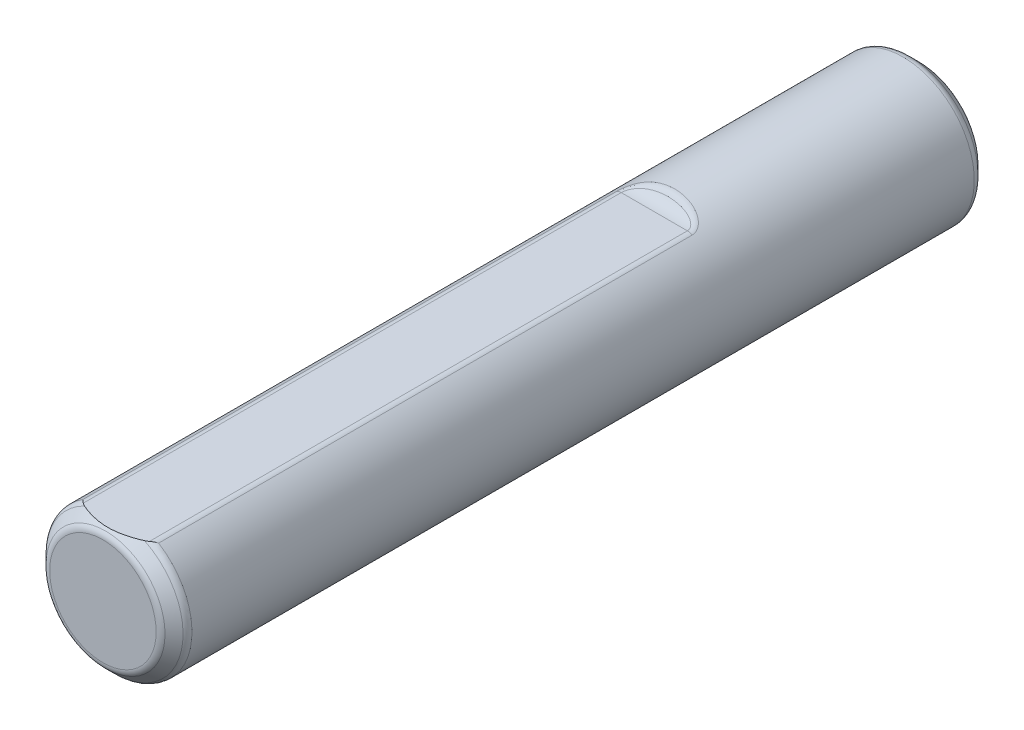
ISO-10303-21;
HEADER;
FILE_DESCRIPTION(('STEP AP214'),'2;1');
FILE_NAME('part.step','',(''),(''),'','','');
FILE_SCHEMA(('AUTOMOTIVE_DESIGN { 1 0 10303 214 1 1 1 1 }'));
ENDSEC;
DATA;
#1=APPLICATION_CONTEXT('core data for automotive mechanical design processes');
#2=APPLICATION_PROTOCOL_DEFINITION('international standard','automotive_design',2000,#1);
#3=PRODUCT_CONTEXT('',#1,'mechanical');
#4=PRODUCT('Part','Part','',(#3));
#5=PRODUCT_RELATED_PRODUCT_CATEGORY('part','',(#4));
#6=PRODUCT_DEFINITION_FORMATION('','',#4);
#7=PRODUCT_DEFINITION_CONTEXT('part definition',#1,'design');
#8=PRODUCT_DEFINITION('design','',#6,#7);
#9=PRODUCT_DEFINITION_SHAPE('','',#8);
#10=(LENGTH_UNIT() NAMED_UNIT(*) SI_UNIT(.MILLI.,.METRE.));
#11=(NAMED_UNIT(*) PLANE_ANGLE_UNIT() SI_UNIT($,.RADIAN.));
#12=(NAMED_UNIT(*) SI_UNIT($,.STERADIAN.) SOLID_ANGLE_UNIT());
#13=UNCERTAINTY_MEASURE_WITH_UNIT(LENGTH_MEASURE(1.E-05),#10,'distance_accuracy_value','');
#14=(GEOMETRIC_REPRESENTATION_CONTEXT(3) GLOBAL_UNCERTAINTY_ASSIGNED_CONTEXT((#13)) GLOBAL_UNIT_ASSIGNED_CONTEXT((#10,
#11,#12)) REPRESENTATION_CONTEXT('',''));
#15=CARTESIAN_POINT('',(0.,0.,0.));
#16=DIRECTION('',(0.,0.,1.));
#17=DIRECTION('',(1.,0.,0.));
#18=AXIS2_PLACEMENT_3D('',#15,#16,#17);
#19=CARTESIAN_POINT('',(0.,0.,18.25625));
#20=DIRECTION('',(0.,0.,-1.));
#21=DIRECTION('',(-1.,0.,0.));
#22=AXIS2_PLACEMENT_3D('',#19,#20,#21);
#23=CYLINDRICAL_SURFACE('',#22,3.175);
#24=CARTESIAN_POINT('',(0.,0.,-17.4568589924332));
#25=DIRECTION('',(0.,0.,-1.));
#26=DIRECTION('',(-1.,0.,0.));
#27=AXIS2_PLACEMENT_3D('',#24,#25,#26);
#28=CIRCLE('',#27,3.175);
#29=CARTESIAN_POINT('',(-3.175,0.,-17.4568589924332));
#30=VERTEX_POINT('',#29);
#31=EDGE_CURVE('E104',#30,#30,#28,.F.);
#32=ORIENTED_EDGE('',*,*,#31,.T.);
#33=EDGE_LOOP('',(#32));
#34=FACE_BOUND('',#33,.T.);
#35=CARTESIAN_POINT('',(-1.32207165040263,2.8100467823214,-6.04625587952027));
#36=CARTESIAN_POINT('',(-1.42627070195704,2.83824671321854,-5.97817237371202));
#37=CARTESIAN_POINT('',(-1.51093902903158,2.79243410854207,-5.8943838192804));
#38=CARTESIAN_POINT('',(-1.34474557274361,2.80186898455058,-6.06594801067835));
#39=CARTESIAN_POINT('',(-1.45041225417174,2.82620009536666,-6.00200570649206));
#40=CARTESIAN_POINT('',(-1.53685208313555,2.77841502664925,-5.92392201601751));
#41=CARTESIAN_POINT('',(-1.36543574553839,2.7941311889469,-6.08692422193137));
#42=CARTESIAN_POINT('',(-1.47246915464072,2.81480971971252,-6.02752947407041));
#43=CARTESIAN_POINT('',(-1.56049799490102,2.76515023418578,-5.95538633289705));
#44=CARTESIAN_POINT('',(-1.40223657039543,2.78003817756422,-6.13118183727184));
#45=CARTESIAN_POINT('',(-1.5116654460137,2.79411123493885,-6.08150892814963));
#46=CARTESIAN_POINT('',(-1.60255608045192,2.74099078610117,-6.02177275590777));
#47=CARTESIAN_POINT('',(-1.41831957461626,2.77369136038421,-6.15447607274859));
#48=CARTESIAN_POINT('',(-1.52879794908003,2.78480488596988,-6.10999053152303));
#49=CARTESIAN_POINT('',(-1.62093665670429,2.73011052807828,-6.05671410912289));
#50=CARTESIAN_POINT('',(-1.44408388792938,2.76336328828293,-6.20118659029518));
#51=CARTESIAN_POINT('',(-1.55622164743804,2.76968784536467,-6.16719782952973));
#52=CARTESIAN_POINT('',(-1.65038158620501,2.71240526161898,-6.12677988544277));
#53=CARTESIAN_POINT('',(-1.45413205218166,2.75924841799026,-6.22448217747395));
#54=CARTESIAN_POINT('',(-1.56691957925823,2.76367177885102,-6.19577981359027));
#55=CARTESIAN_POINT('',(-1.66186520249333,2.70535119826017,-6.1617232662109));
#56=CARTESIAN_POINT('',(-1.46900725276046,2.75311439120509,-6.27198493605406));
#57=CARTESIAN_POINT('',(-1.58274531113447,2.75471423353387,-6.25410055052108));
#58=CARTESIAN_POINT('',(-1.67886543172624,2.69483572377119,-6.23297740408111));
#59=CARTESIAN_POINT('',(-1.47385766076059,2.75108585519742,-6.29618751608562));
#60=CARTESIAN_POINT('',(-1.58790780156396,2.75175354085903,-6.28385028585637));
#61=CARTESIAN_POINT('',(-1.68440875515493,2.69135823347215,-6.2692812741285));
#62=CARTESIAN_POINT('',(-1.47689967821775,2.74981272109505,-6.33032116283234));
#63=CARTESIAN_POINT('',(-1.59114427374145,2.74989619556427,-6.32580864544486));
#64=CARTESIAN_POINT('',(-1.68788534653458,2.6891757178684,-6.32048174424848));
#65=CARTESIAN_POINT('',(-1.47733721054668,2.7496293720565,-6.34015722021935));
#66=CARTESIAN_POINT('',(-1.59160974358518,2.74962875336928,-6.33790053133293));
#67=CARTESIAN_POINT('',(-1.68838538348195,2.68886140523105,-6.33523583032894));
#68=CARTESIAN_POINT('',(-1.47732956919922,2.74963428952543,-6.37782500598482));
#69=CARTESIAN_POINT('',(-1.59160112037149,2.74963603852293,-6.38420455736032));
#70=CARTESIAN_POINT('',(-1.68837665051333,2.68886983517685,-6.39173750897748));
#71=CARTESIAN_POINT('',(-1.47381137403713,2.75111344736394,-6.40570373480625));
#72=CARTESIAN_POINT('',(-1.58785619112029,2.75179433014627,-6.41848914172735));
#73=CARTESIAN_POINT('',(-1.68435585604196,2.69140553432475,-6.43355560221106));
#74=CARTESIAN_POINT('',(-1.45992987632037,2.75686591127611,-6.46044023231048));
#75=CARTESIAN_POINT('',(-1.57308880254845,2.76019127081532,-6.4857189373531));
#76=CARTESIAN_POINT('',(-1.66849128722376,2.70126690104039,-6.51566034846404));
#77=CARTESIAN_POINT('',(-1.44954556040068,2.76114779452294,-6.48729459829238));
#78=CARTESIAN_POINT('',(-1.56203184542318,2.76644930957503,-6.51868616802151));
#79=CARTESIAN_POINT('',(-1.65662349760259,2.70860727233362,-6.55594189743208));
#80=CARTESIAN_POINT('',(-1.42264538468785,2.77197570062903,-6.53884313195875));
#81=CARTESIAN_POINT('',(-1.53340288379502,2.7822917200939,-6.58183960338655));
#82=CARTESIAN_POINT('',(-1.62588043964145,2.72716939705208,-6.63326469794456));
#83=CARTESIAN_POINT('',(-1.40617966295608,2.77850318034929,-6.56355297813435));
#84=CARTESIAN_POINT('',(-1.51586266131256,2.79186030025682,-6.61206613291999));
#85=CARTESIAN_POINT('',(-1.60706247194307,2.73835936223949,-6.67032946722552));
#86=CARTESIAN_POINT('',(-1.36791385886504,2.79320324032788,-6.6105408173833));
#87=CARTESIAN_POINT('',(-1.47510747952988,2.81344564160556,-6.66938766966213));
#88=CARTESIAN_POINT('',(-1.56333012442394,2.76355946518937,-6.7408112260509));
#89=CARTESIAN_POINT('',(-1.34610530378368,2.80137842985475,-6.63281486579089));
#90=CARTESIAN_POINT('',(-1.45185719793936,2.82547892059554,-6.69648868940852));
#91=CARTESIAN_POINT('',(-1.53840606149228,2.77757407598398,-6.77422229859656));
#92=CARTESIAN_POINT('',(-1.29104891474577,2.82123592626427,-6.68075968592093));
#93=CARTESIAN_POINT('',(-1.39313310848543,2.85478254218719,-6.75464460090985));
#94=CARTESIAN_POINT('',(-1.47548447396263,2.81161549784616,-6.84613952899727));
#95=CARTESIAN_POINT('',(-1.25631877606677,2.83324676593788,-6.70553458977082));
#96=CARTESIAN_POINT('',(-1.35605064401268,2.87256343362649,-6.78453135842377));
#97=CARTESIAN_POINT('',(-1.43579288679562,2.83220550770484,-6.88330188514706));
#98=CARTESIAN_POINT('',(-1.18121513756945,2.8576932692922,-6.75066592284944));
#99=CARTESIAN_POINT('',(-1.27582496624973,2.90887047977529,-6.8386770355743));
#100=CARTESIAN_POINT('',(-1.34996015708952,2.87411379914154,-6.95099888478773));
#101=CARTESIAN_POINT('',(-1.14083144085465,2.87012966920092,-6.77101419486451));
#102=CARTESIAN_POINT('',(-1.23262267505968,2.92741067672239,-6.86291407072626));
#103=CARTESIAN_POINT('',(-1.30380736095487,2.89543334282839,-6.98152129245677));
#104=CARTESIAN_POINT('',(-1.03746299405192,2.8997840680519,-6.81564433321683));
#105=CARTESIAN_POINT('',(-1.12183132213562,2.97181924282382,-6.91579190109043));
#106=CARTESIAN_POINT('',(-1.18567199323355,2.94626945603067,-7.04846649959593));
#107=CARTESIAN_POINT('',(-0.972265448665181,2.91673986171008,-6.83781219861418));
#108=CARTESIAN_POINT('',(-1.05187455808933,2.99731705254845,-6.94166052786583));
#109=CARTESIAN_POINT('',(-1.11116051264025,2.97533653011796,-7.08171829786016));
#110=CARTESIAN_POINT('',(-0.836336280405914,2.9479495099681,-6.87544808570067));
#111=CARTESIAN_POINT('',(-0.905746169692841,3.044492616748,-6.98517396658918));
#112=CARTESIAN_POINT('',(-0.955812891731555,3.02883878392182,-7.13817212861459));
#113=CARTESIAN_POINT('',(-0.765593451959779,2.96219768341735,-6.89090210579454));
#114=CARTESIAN_POINT('',(-0.829561662036831,3.06612117613531,-7.00273036040346));
#115=CARTESIAN_POINT('',(-0.874963945046859,3.05326422452552,-7.16135315871143));
#116=CARTESIAN_POINT('',(-0.590781972742733,2.99221316915946,-6.92175235918077));
#117=CARTESIAN_POINT('',(-0.640639053889406,3.11196873120621,-7.03753518672004));
#118=CARTESIAN_POINT('',(-0.675179397490837,3.10471934337655,-7.20762853874378));
#119=CARTESIAN_POINT('',(-0.484975349899006,3.00619434187599,-6.93450971425422));
#120=CARTESIAN_POINT('',(-0.526287088079069,3.13337354142008,-7.05148623665805));
#121=CARTESIAN_POINT('',(-0.554257542761624,3.12868706784207,-7.22676457137517));
#122=CARTESIAN_POINT('',(-0.270195437416657,3.02585393143428,-6.95197106065672));
#123=CARTESIAN_POINT('',(-0.293328433212091,3.16365728802855,-7.07052799525626));
#124=CARTESIAN_POINT('',(-0.308794785599109,3.16238922124335,-7.25295659099124));
#125=CARTESIAN_POINT('',(-0.161218330389011,3.03152187792551,-6.95666489740898));
#126=CARTESIAN_POINT('',(-0.175190363195909,3.17238946115066,-7.07551996156965));
#127=CARTESIAN_POINT('',(-0.184249520435573,3.17210570100708,-7.25999734611069));
#128=CARTESIAN_POINT('',(0.0593470236745363,3.03427620677836,-6.95897911169985));
#129=CARTESIAN_POINT('',(0.0645532373385034,3.17664967684363,-7.07800470574967));
#130=CARTESIAN_POINT('',(0.0678251699045632,3.17682740761028,-7.26346866755261));
#131=CARTESIAN_POINT('',(0.170943597179816,3.03118716750508,-6.95645488687237));
#132=CARTESIAN_POINT('',(0.185577019583757,3.17188686623728,-7.07533211758867));
#133=CARTESIAN_POINT('',(0.195364111046246,3.17153191164441,-7.25968233032642));
#134=CARTESIAN_POINT('',(0.391729869823104,3.01619061796338,-6.94347765803756));
#135=CARTESIAN_POINT('',(0.42528301594677,3.1487432457971,-7.06127979195355));
#136=CARTESIAN_POINT('',(0.447691279814216,3.14582354114076,-7.24021648703849));
#137=CARTESIAN_POINT('',(0.500922245066709,3.0042934823108,-6.93303398160536));
#138=CARTESIAN_POINT('',(0.543417519178574,3.13048768342262,-7.04997839470276));
#139=CARTESIAN_POINT('',(0.572482565846844,3.12542845165838,-7.22455097233951));
#140=CARTESIAN_POINT('',(0.682237603185872,2.97723196879833,-6.90655345477374));
#141=CARTESIAN_POINT('',(0.739647868769432,3.08902543385197,-7.02039941706576));
#142=CARTESIAN_POINT('',(0.779700117886866,3.07903728516344,-7.1848301822091));
#143=CARTESIAN_POINT('',(0.755860698789501,2.96404136033422,-6.89304638900379));
#144=CARTESIAN_POINT('',(0.819044639050527,3.0689374320709,-7.00521818908055));
#145=CARTESIAN_POINT('',(0.863840798488703,3.05642481307164,-7.16456958366231));
#146=CARTESIAN_POINT('',(0.898242766086338,2.9344285906304,-6.85962633819342));
#147=CARTESIAN_POINT('',(0.972347791597128,3.024013321321,-6.96694793183845));
#148=CARTESIAN_POINT('',(1.0265631611478,3.00566006532257,-7.11443950732362));
#149=CARTESIAN_POINT('',(0.967009999384453,2.91801210711701,-6.83972456966013));
#150=CARTESIAN_POINT('',(1.04623005434996,2.99923872305304,-6.94394438578667));
#151=CARTESIAN_POINT('',(1.10515428503887,2.97751752290831,-7.084586854293));
#152=CARTESIAN_POINT('',(1.07805979947977,2.88839923415911,-6.79885779551555));
#153=CARTESIAN_POINT('',(1.16541514966823,2.95472701221919,-6.89590460927435));
#154=CARTESIAN_POINT('',(1.23206834224264,2.92675259709854,-7.02328669341468));
#155=CARTESIAN_POINT('',(1.12224146156758,2.8756487657545,-6.779873110788));
#156=CARTESIAN_POINT('',(1.21273347542142,2.93565158288577,-6.87345703474821));
#157=CARTESIAN_POINT('',(1.28256167024745,2.90489465035819,-6.9948096666801));
#158=CARTESIAN_POINT('',(1.20530353514589,2.85009845492655,-6.73731529569357));
#159=CARTESIAN_POINT('',(1.30155502395066,2.89757560489682,-6.82270655339062));
#160=CARTESIAN_POINT('',(1.37748975446713,2.8610941179738,-6.9309729439574));
#161=CARTESIAN_POINT('',(1.24419263988976,2.8372987298649,-6.71374984792886));
#162=CARTESIAN_POINT('',(1.34311268282516,2.87856746998419,-6.79443232423601));
#163=CARTESIAN_POINT('',(1.42193444582813,2.83915173351746,-6.89562477187382));
#164=CARTESIAN_POINT('',(1.30703929081154,2.81556136343849,-6.66751710251426));
#165=CARTESIAN_POINT('',(1.41019932124402,2.84639621439673,-6.73858771799417));
#166=CARTESIAN_POINT('',(1.49375918931218,2.80188767569228,-6.82627565378662));
#167=CARTESIAN_POINT('',(1.33239620097094,2.80639624538967,-6.64580699388204));
#168=CARTESIAN_POINT('',(1.43724871339305,2.83287096100675,-6.71227039532437));
#169=CARTESIAN_POINT('',(1.52273851474008,2.78617604307316,-6.79371049112986));
#170=CARTESIAN_POINT('',(1.37779645716675,2.78948430735387,-6.59956518448832));
#171=CARTESIAN_POINT('',(1.48562712863314,2.8079813358103,-6.65602454607927));
#172=CARTESIAN_POINT('',(1.57462452182811,2.75718414924267,-6.72434777707755));
#173=CARTESIAN_POINT('',(1.39784881505763,2.78173508892843,-6.57503837202437));
#174=CARTESIAN_POINT('',(1.50699649473098,2.79659968600321,-6.62609474347805));
#175=CARTESIAN_POINT('',(1.59754150274885,2.74389977641685,-6.68755755812927));
#176=CARTESIAN_POINT('',(1.43187537936603,2.76831312545711,-6.52329461979339));
#177=CARTESIAN_POINT('',(1.54322072761075,2.77693105116248,-6.56281762999934));
#178=CARTESIAN_POINT('',(1.63642900516577,2.72089069737546,-6.60994192959637));
#179=CARTESIAN_POINT('',(1.44578208156869,2.76266354522238,-6.49605164646248));
#180=CARTESIAN_POINT('',(1.55803183525649,2.76866398090797,-6.52941818132377));
#181=CARTESIAN_POINT('',(1.65232237898135,2.71120570224261,-6.56907746966937));
#182=CARTESIAN_POINT('',(1.46630713805946,2.75424466328262,-6.43999394607865));
#183=CARTESIAN_POINT('',(1.57986987226772,2.75636470545645,-6.46062577791935));
#184=CARTESIAN_POINT('',(1.67577958630812,2.69677333289153,-6.48499091914222));
#185=CARTESIAN_POINT('',(1.47295033101748,2.75146554740608,-6.41118493144586));
#186=CARTESIAN_POINT('',(1.58694225565364,2.75230759388412,-6.42521287044414));
#187=CARTESIAN_POINT('',(1.68337180687005,2.69200913437728,-6.44177739717258));
#188=CARTESIAN_POINT('',(1.47681649013855,2.74984738855746,-6.37148756340825));
#189=CARTESIAN_POINT('',(1.59105582706194,2.74994675179592,-6.37641498313703));
#190=CARTESIAN_POINT('',(1.68779027444665,2.6892351478128,-6.38223134511098));
#191=CARTESIAN_POINT('',(1.47733775333248,2.74962903159685,-6.36074765550897));
#192=CARTESIAN_POINT('',(1.59161035429519,2.74962824886559,-6.36321180089439));
#193=CARTESIAN_POINT('',(1.68838600380945,2.68886082158892,-6.36612148326292));
#194=CARTESIAN_POINT('',(1.47732864767858,2.74963485969545,-6.32221088068855));
#195=CARTESIAN_POINT('',(1.59160008514671,2.7496368835271,-6.3158395738147));
#196=CARTESIAN_POINT('',(1.68837559734424,2.68887081260291,-6.30831632103418));
#197=CARTESIAN_POINT('',(1.47382029373183,2.75110971460775,-6.29436996614019));
#198=CARTESIAN_POINT('',(1.58786567169511,2.75178888992976,-6.28160171118982));
#199=CARTESIAN_POINT('',(1.6843660499785,2.69139913531625,-6.26655494921065));
#200=CARTESIAN_POINT('',(1.45995720759185,2.75685461616372,-6.23962880482375));
#201=CARTESIAN_POINT('',(1.57311790467366,2.76017476490073,-6.21436556413282));
#202=CARTESIAN_POINT('',(1.66852252296285,2.70124753798847,-6.18444320723526));
#203=CARTESIAN_POINT('',(1.44956368193998,2.76114049975895,-6.21273480281257));
#204=CARTESIAN_POINT('',(1.56205114733024,2.7664386265274,-6.18134896712554));
#205=CARTESIAN_POINT('',(1.65664420793162,2.70859476700712,-6.14410220421875));
#206=CARTESIAN_POINT('',(1.42258520702225,2.77199992389683,-6.16104684887082));
#207=CARTESIAN_POINT('',(1.53333868364277,2.78232724848016,-6.11802619439438));
#208=CARTESIAN_POINT('',(1.62581166516808,2.72721092267067,-6.06657027330633));
#209=CARTESIAN_POINT('',(1.40603113483383,2.77856204482809,-6.13624316798653));
#210=CARTESIAN_POINT('',(1.51570408669181,2.79194679037121,-6.08768731416044));
#211=CARTESIAN_POINT('',(1.60689272552427,2.73846027283889,-6.02936475197984));
#212=CARTESIAN_POINT('',(1.36772085352907,2.79327556980631,-6.0892441168747));
#213=CARTESIAN_POINT('',(1.47490221215476,2.81355183748334,-6.03034779774084));
#214=CARTESIAN_POINT('',(1.56310954689047,2.76368345851653,-5.958866175312));
#215=CARTESIAN_POINT('',(1.34600332458098,2.80141507736347,-6.06703110107984));
#216=CARTESIAN_POINT('',(1.4517496862216,2.82553232154174,-6.00331288247671));
#217=CARTESIAN_POINT('',(1.53828951380704,2.77763690004342,-5.92554665161965));
#218=CARTESIAN_POINT('',(1.32207165040264,2.8100467823214,-6.04625587952028));
#219=CARTESIAN_POINT('',(1.42627070195705,2.83824671321853,-5.97817237371203));
#220=CARTESIAN_POINT('',(1.51093902903159,2.79243410854206,-5.89438381928042));
#221=(BOUNDED_SURFACE() B_SPLINE_SURFACE(3,2,((#35,#36,#37),(#38,#39,#40),(#41,#42,#43),(#44,
#45,#46),(#47,#48,#49),(#50,#51,#52),(#53,#54,#55),(#56,#57,#58),(#59,#60,#61),(#62,#63,#64),
(#65,#66,#67),(#68,#69,#70),(#71,#72,#73),(#74,#75,#76),(#77,#78,#79),(#80,#81,#82),(#83,#84,
#85),(#86,#87,#88),(#89,#90,#91),(#92,#93,#94),(#95,#96,#97),(#98,#99,#100),(#101,#102,#103),
(#104,#105,#106),(#107,#108,#109),(#110,#111,#112),(#113,#114,#115),(#116,#117,#118),(#119,#120,
#121),(#122,#123,#124),(#125,#126,#127),(#128,#129,#130),(#131,#132,#133),(#134,#135,#136),
(#137,#138,#139),(#140,#141,#142),(#143,#144,#145),(#146,#147,#148),(#149,#150,#151),(#152,#153,
#154),(#155,#156,#157),(#158,#159,#160),(#161,#162,#163),(#164,#165,#166),(#167,#168,#169),
(#170,#171,#172),(#173,#174,#175),(#176,#177,#178),(#179,#180,#181),(#182,#183,#184),(#185,#186,
#187),(#188,#189,#190),(#191,#192,#193),(#194,#195,#196),(#197,#198,#199),(#200,#201,#202),
(#203,#204,#205),(#206,#207,#208),(#209,#210,#211),(#212,#213,#214),(#215,#216,#217),(#218,#219,
#220)),.UNSPECIFIED.,.F.,.F.,.F.) B_SPLINE_SURFACE_WITH_KNOTS((4,2,2,2,2,2,2,2,2,2,2,2,2,2,2,2,
2,2,2,2,2,2,2,2,2,2,2,2,2,2,4),(3,3),(0.,0.11767285137814,0.23603773890203,0.346186994418473,
0.45583885916516,0.500110486964787,0.62526398383608,0.750802289679726,0.875327895506056,
1.00005226834774,1.1610469863495,1.32233591181412,1.553488506876,1.78512087879151,
2.1120379667878,2.43936644812484,2.7732980961268,3.10683704724978,3.34280846067473,
3.57836821190688,3.7456484662584,3.9126505510387,4.042662455059,4.1724520435504,
4.30363381493469,4.4343655736162,4.48270671416423,4.60769748272979,4.73339855177091,
4.85847790251978,4.98264825496616),(0.,1.),
.UNSPECIFIED.) GEOMETRIC_REPRESENTATION_ITEM() RATIONAL_B_SPLINE_SURFACE(((1.,0.951988266237016,
1.),(1.,0.95329835088446,1.),(1.,0.95449575650943,1.),(1.,0.956626044552082,1.),(1.,
0.95755732989013,1.),(1.,0.959046192416257,1.),(1.,0.959625221834319,1.),(1.,0.960481374626771,
1.),(1.,0.960759849483441,1.),(1.,0.960934460631352,1.),(1.,0.9609595647079,1.),(1.,
0.960959172186939,1.),(1.,0.960757440232256,1.),(1.,0.95995909189517,1.),(1.,0.959361263270269,
1.),(1.,0.957807647398768,1.),(1.,0.956854786657726,1.),(1.,0.954638865335899,1.),(1.,
0.953375312043747,1.),(1.,0.950197861976626,1.),(1.,0.948201697583379,1.),(1.,0.943955680182605,
1.),(1.,0.941705370241729,1.),(1.,0.936120794515517,1.),(1.,0.93273922134245,1.),(1.,
0.926230843608375,1.),(1.,0.923104582409268,1.),(1.,0.91631278185762,1.),(1.,0.912954425457446,
1.),(1.,0.908155738682721,1.),(1.,0.906717827275485,1.),(1.,0.906025064620471,1.),(1.,
0.906814837192436,1.),(1.,0.910526022643272,1.),(1.,0.913444927663961,1.),(1.,0.919727242254669,
1.),(1.,0.922710855964052,1.),(1.,0.929094168158431,1.),(1.,0.932493131685377,1.),(1.,
0.938288341418407,1.),(1.,0.940689657758214,1.),(1.,0.945302220367878,1.),(1.,0.947513776064215,
1.),(1.,0.951117936006694,1.),(1.,0.952583434852406,1.),(1.,0.95521055552801,1.),(1.,
0.956372692691239,1.),(1.,0.958341347693404,1.),(1.,0.959143917283745,1.),(1.,0.960326408139613,
1.),(1.,0.960707769835079,1.),(1.,0.960929681829485,1.),(1.,0.960959594488442,1.),(1.,
0.960959119940841,1.),(1.,0.960757917304241,1.),(1.,0.959960699495424,1.),(1.,0.959362447170992,
1.),(1.,0.957804035231432,1.),(1.,0.956845680247116,1.),(1.,0.954628190145818,1.),(1.,
0.953371291525508,1.),(1.,0.951988266237017,1.))) REPRESENTATION_ITEM('') SURFACE());
#222=CARTESIAN_POINT('',(-1.51093902903158,2.79243410854207,-5.8943838192804));
#223=CARTESIAN_POINT('',(-1.53685208313555,2.77841502664925,-5.92392201601751));
#224=CARTESIAN_POINT('',(-1.56049799490102,2.76515023418578,-5.95538633289705));
#225=CARTESIAN_POINT('',(-1.60255608045192,2.74099078610117,-6.02177275590777));
#226=CARTESIAN_POINT('',(-1.62093665670429,2.73011052807828,-6.05671410912289));
#227=CARTESIAN_POINT('',(-1.65038158620501,2.71240526161898,-6.12677988544277));
#228=CARTESIAN_POINT('',(-1.66186520249333,2.70535119826017,-6.1617232662109));
#229=CARTESIAN_POINT('',(-1.67886543172624,2.69483572377119,-6.23297740408111));
#230=CARTESIAN_POINT('',(-1.68440875515493,2.69135823347215,-6.2692812741285));
#231=CARTESIAN_POINT('',(-1.68788534653458,2.6891757178684,-6.32048174424848));
#232=CARTESIAN_POINT('',(-1.68838538348195,2.68886140523105,-6.33523583032894));
#233=CARTESIAN_POINT('',(-1.68837665051333,2.68886983517685,-6.39173750897748));
#234=CARTESIAN_POINT('',(-1.68435585604196,2.69140553432475,-6.43355560221106));
#235=CARTESIAN_POINT('',(-1.66849128722376,2.70126690104039,-6.51566034846404));
#236=CARTESIAN_POINT('',(-1.65662349760259,2.70860727233362,-6.55594189743208));
#237=CARTESIAN_POINT('',(-1.62588043964145,2.72716939705208,-6.63326469794456));
#238=CARTESIAN_POINT('',(-1.60706247194307,2.73835936223949,-6.67032946722552));
#239=CARTESIAN_POINT('',(-1.56333012442394,2.76355946518937,-6.74081122605091));
#240=CARTESIAN_POINT('',(-1.53840606149228,2.77757407598398,-6.77422229859656));
#241=CARTESIAN_POINT('',(-1.47548447396263,2.81161549784616,-6.84613952899727));
#242=CARTESIAN_POINT('',(-1.43579288679562,2.83220550770484,-6.88330188514706));
#243=CARTESIAN_POINT('',(-1.34996015708952,2.87411379914154,-6.95099888478773));
#244=CARTESIAN_POINT('',(-1.30380736095487,2.89543334282839,-6.98152129245677));
#245=CARTESIAN_POINT('',(-1.18567199323355,2.94626945603067,-7.04846649959593));
#246=CARTESIAN_POINT('',(-1.11116051264025,2.97533653011796,-7.08171829786016));
#247=CARTESIAN_POINT('',(-0.955812891731555,3.02883878392182,-7.13817212861459));
#248=CARTESIAN_POINT('',(-0.874963945046859,3.05326422452552,-7.16135315871143));
#249=CARTESIAN_POINT('',(-0.675179397490837,3.10471934337655,-7.20762853874378));
#250=CARTESIAN_POINT('',(-0.554257542761624,3.12868706784207,-7.22676457137517));
#251=CARTESIAN_POINT('',(-0.30879478559911,3.16238922124335,-7.25295659099124));
#252=CARTESIAN_POINT('',(-0.184249520435573,3.17210570100708,-7.25999734611069));
#253=CARTESIAN_POINT('',(0.0678251699045632,3.17682740761028,-7.26346866755261));
#254=CARTESIAN_POINT('',(0.195364111046246,3.17153191164441,-7.25968233032642));
#255=CARTESIAN_POINT('',(0.447691279814216,3.14582354114076,-7.24021648703849));
#256=CARTESIAN_POINT('',(0.572482565846844,3.12542845165838,-7.22455097233951));
#257=CARTESIAN_POINT('',(0.779700117886866,3.07903728516344,-7.1848301822091));
#258=CARTESIAN_POINT('',(0.863840798488703,3.05642481307164,-7.16456958366231));
#259=CARTESIAN_POINT('',(1.0265631611478,3.00566006532257,-7.11443950732362));
#260=CARTESIAN_POINT('',(1.10515428503887,2.97751752290831,-7.084586854293));
#261=CARTESIAN_POINT('',(1.23206834224264,2.92675259709854,-7.02328669341468));
#262=CARTESIAN_POINT('',(1.28256167024745,2.90489465035819,-6.9948096666801));
#263=CARTESIAN_POINT('',(1.37748975446713,2.8610941179738,-6.9309729439574));
#264=CARTESIAN_POINT('',(1.42193444582813,2.83915173351746,-6.89562477187382));
#265=CARTESIAN_POINT('',(1.49375918931218,2.80188767569228,-6.82627565378662));
#266=CARTESIAN_POINT('',(1.52273851474008,2.78617604307316,-6.79371049112986));
#267=CARTESIAN_POINT('',(1.57462452182811,2.75718414924267,-6.72434777707755));
#268=CARTESIAN_POINT('',(1.59754150274885,2.74389977641685,-6.68755755812927));
#269=CARTESIAN_POINT('',(1.63642900516577,2.72089069737546,-6.60994192959637));
#270=CARTESIAN_POINT('',(1.65232237898135,2.71120570224261,-6.56907746966937));
#271=CARTESIAN_POINT('',(1.67577958630812,2.69677333289152,-6.48499091914222));
#272=CARTESIAN_POINT('',(1.68337180687005,2.69200913437728,-6.44177739717258));
#273=CARTESIAN_POINT('',(1.68779027444665,2.6892351478128,-6.38223134511098));
#274=CARTESIAN_POINT('',(1.68838600380945,2.68886082158892,-6.36612148326292));
#275=CARTESIAN_POINT('',(1.68837559734424,2.68887081260291,-6.30831632103418));
#276=CARTESIAN_POINT('',(1.6843660499785,2.69139913531625,-6.26655494921065));
#277=CARTESIAN_POINT('',(1.66852252296285,2.70124753798847,-6.18444320723526));
#278=CARTESIAN_POINT('',(1.65664420793162,2.70859476700712,-6.14410220421874));
#279=CARTESIAN_POINT('',(1.62581166516808,2.72721092267067,-6.06657027330633));
#280=CARTESIAN_POINT('',(1.60689272552427,2.73846027283889,-6.02936475197984));
#281=CARTESIAN_POINT('',(1.56310954689047,2.76368345851653,-5.95886617531199));
#282=CARTESIAN_POINT('',(1.53828951380704,2.77763690004342,-5.92554665161965));
#283=CARTESIAN_POINT('',(1.51093902903159,2.79243410854206,-5.89438381928042));
#284=B_SPLINE_CURVE_WITH_KNOTS('',3,(#222,#223,#224,#225,#226,#227,#228,#229,#230,#231,#232,
#233,#234,#235,#236,#237,#238,#239,#240,#241,#242,#243,#244,#245,#246,#247,#248,#249,#250,#251,
#252,#253,#254,#255,#256,#257,#258,#259,#260,#261,#262,#263,#264,#265,#266,#267,#268,#269,#270,
#271,#272,#273,#274,#275,#276,#277,#278,#279,#280,#281,#282,#283),.UNSPECIFIED.,.F.,.F.,(4,2,2,
2,2,2,2,2,2,2,2,2,2,2,2,2,2,2,2,2,2,2,2,2,2,2,2,2,2,2,4),(0.,0.11767285137814,0.23603773890203,
0.346186994418473,0.45583885916516,0.500110486964787,0.62526398383608,0.750802289679726,
0.875327895506056,1.00005226834774,1.1610469863495,1.32233591181412,1.553488506876,
1.78512087879151,2.1120379667878,2.43936644812484,2.7732980961268,3.10683704724978,
3.34280846067473,3.57836821190688,3.7456484662584,3.9126505510387,4.042662455059,
4.1724520435504,4.30363381493469,4.4343655736162,4.48270671416423,4.60769748272979,
4.73339855177091,4.85847790251978,4.98264825496616),.UNSPECIFIED.);
#285=CARTESIAN_POINT('',(-1.68838310151381,2.68886360801782,-6.35));
#286=VERTEX_POINT('',#285);
#287=CARTESIAN_POINT('',(1.68838310151381,2.68886360801782,-6.35));
#288=VERTEX_POINT('',#287);
#289=EDGE_CURVE('E55',#286,#288,#284,.T.);
#290=ORIENTED_EDGE('',*,*,#289,.T.);
#291=DIRECTION('',(0.,0.,-1.));
#292=VECTOR('',#291,1.);
#293=CARTESIAN_POINT('',(1.68838310151381,2.68886360801782,18.25625));
#294=LINE('',#293,#292);
#295=CARTESIAN_POINT('',(1.68838310151381,2.68886360801782,17.4568589924332));
#296=VERTEX_POINT('',#295);
#297=EDGE_CURVE('E92',#288,#296,#294,.F.);
#298=ORIENTED_EDGE('',*,*,#297,.T.);
#299=CARTESIAN_POINT('',(0.,0.,17.4568589924332));
#300=DIRECTION('',(0.,0.,1.));
#301=DIRECTION('',(1.,0.,0.));
#302=AXIS2_PLACEMENT_3D('',#299,#300,#301);
#303=CIRCLE('',#302,3.175);
#304=CARTESIAN_POINT('',(-1.68838310151381,2.68886360801782,17.4568589924332));
#305=VERTEX_POINT('',#304);
#306=EDGE_CURVE('E210',#296,#305,#303,.F.);
#307=ORIENTED_EDGE('',*,*,#306,.T.);
#308=DIRECTION('',(0.,0.,-1.));
#309=VECTOR('',#308,1.);
#310=CARTESIAN_POINT('',(-1.68838310151381,2.68886360801782,18.25625));
#311=LINE('',#310,#309);
#312=EDGE_CURVE('E113',#305,#286,#311,.T.);
#313=ORIENTED_EDGE('',*,*,#312,.T.);
#314=EDGE_LOOP('',(#290,#298,#307,#313));
#315=FACE_BOUND('',#314,.T.);
#316=ADVANCED_FACE('F32',(#34,#315),#23,.T.);
#317=CARTESIAN_POINT('',(0.,0.,18.25625));
#318=DIRECTION('',(0.,0.,-1.));
#319=DIRECTION('',(-1.,0.,0.));
#320=AXIS2_PLACEMENT_3D('',#317,#318,#319);
#321=CONICAL_SURFACE('',#320,2.53999999999999,0.785398163397446);
#322=CARTESIAN_POINT('',(0.,0.,18.1400080037834));
#323=DIRECTION('',(0.,0.,1.));
#324=DIRECTION('',(1.,0.,0.));
#325=AXIS2_PLACEMENT_3D('',#322,#323,#324);
#326=CIRCLE('',#325,2.65624199621658);
#327=CARTESIAN_POINT('',(2.65624199621658,0.,18.1400080037834));
#328=VERTEX_POINT('',#327);
#329=EDGE_CURVE('E11',#328,#328,#326,.F.);
#330=ORIENTED_EDGE('',*,*,#329,.T.);
#331=EDGE_LOOP('',(#330));
#332=FACE_BOUND('',#331,.T.);
#333=CARTESIAN_POINT('',(-3.22896135223729,2.74963065701559,16.5551817189837));
#334=CARTESIAN_POINT('',(-3.15061649550104,2.74963065701559,16.614816524546));
#335=CARTESIAN_POINT('',(-3.07184009651262,2.74963065701559,16.673893482025));
#336=CARTESIAN_POINT('',(-2.91325130568818,2.74963065701559,16.7906797176183));
#337=CARTESIAN_POINT('',(-2.83343866506294,2.74963065701559,16.8483886575258));
#338=CARTESIAN_POINT('',(-2.67202062852745,2.74963065701559,16.9625975478051));
#339=CARTESIAN_POINT('',(-2.59040613970428,2.74963065701559,17.0190846895372));
#340=CARTESIAN_POINT('',(-2.42580311622163,2.74963065701559,17.1300135143344));
#341=CARTESIAN_POINT('',(-2.34281467809334,2.74963065701559,17.1844553402285));
#342=CARTESIAN_POINT('',(-2.17021447787228,2.74963065701559,17.2940238711656));
#343=CARTESIAN_POINT('',(-2.08050398524192,2.74963065701559,17.3489958353402));
#344=CARTESIAN_POINT('',(-1.89900904678691,2.74963065701559,17.4553969931978));
#345=CARTESIAN_POINT('',(-1.80722487525634,2.74963065701559,17.5068266518349));
#346=CARTESIAN_POINT('',(-1.62153760368929,2.74963065701559,17.6050648050514));
#347=CARTESIAN_POINT('',(-1.52764140922493,2.74963065701559,17.6518862501767));
#348=CARTESIAN_POINT('',(-1.33724706572099,2.74963065701559,17.7398508153407));
#349=CARTESIAN_POINT('',(-1.24075014112707,2.74963065701559,17.7809965535942));
#350=CARTESIAN_POINT('',(-1.05364742760748,2.74963065701559,17.8528064372305));
#351=CARTESIAN_POINT('',(-0.963276425588637,2.74963065701559,17.8840760439732));
#352=CARTESIAN_POINT('',(-0.780303735161102,2.74963065701559,17.9393731873504));
#353=CARTESIAN_POINT('',(-0.687701898779461,2.74963065701559,17.9634002421446));
#354=CARTESIAN_POINT('',(-0.502391431282851,2.74963065701559,18.0025382908411));
#355=CARTESIAN_POINT('',(-0.409716445146756,2.74963065701559,18.0178059547489));
#356=CARTESIAN_POINT('',(-0.223306330685269,2.74963065701559,18.0391188420294));
#357=CARTESIAN_POINT('',(-0.129571403437371,2.74963065701559,18.0451657860141));
#358=CARTESIAN_POINT('',(0.0543357559016721,2.74963065701559,18.0475594852485));
#359=CARTESIAN_POINT('',(0.14450324255236,2.74963065701559,18.0442780862278));
#360=CARTESIAN_POINT('',(0.324095543573404,2.74963065701559,18.0290317719638));
#361=CARTESIAN_POINT('',(0.413520286896858,2.74963065701559,18.0170660354814));
#362=CARTESIAN_POINT('',(0.592496066024062,2.74963065701559,17.9849115235361));
#363=CARTESIAN_POINT('',(0.682021177379007,2.74963065701559,17.9645805801752));
#364=CARTESIAN_POINT('',(0.859103373963812,2.74963065701559,17.916795197954));
#365=CARTESIAN_POINT('',(0.946660601088772,2.74963065701559,17.8893412745013));
#366=CARTESIAN_POINT('',(1.21954622680462,2.74963065701559,17.7933794821897));
#367=CARTESIAN_POINT('',(1.40108594012665,2.74963065701559,17.7140594527363));
#368=CARTESIAN_POINT('',(1.66675889489858,2.74963065701559,17.5818039852257));
#369=CARTESIAN_POINT('',(1.75437488385015,2.74963065701559,17.5354026611238));
#370=CARTESIAN_POINT('',(1.92761951465599,2.74963065701559,17.4390192377677));
#371=CARTESIAN_POINT('',(2.01324850705455,2.74963065701559,17.3890377765756));
#372=CARTESIAN_POINT('',(2.17855184285735,2.74963065701559,17.2887638433061));
#373=CARTESIAN_POINT('',(2.25831097248799,2.74963065701559,17.2386095590396));
#374=CARTESIAN_POINT('',(2.41646118639996,2.74963065701559,17.1361782177625));
#375=CARTESIAN_POINT('',(2.49485216688177,2.74963065701559,17.0839010006805));
#376=CARTESIAN_POINT('',(2.64980987258628,2.74963065701559,16.9780331250554));
#377=CARTESIAN_POINT('',(2.72638621983958,2.74963065701559,16.9244564917739));
#378=CARTESIAN_POINT('',(2.87849044969165,2.74963065701559,16.8158770900169));
#379=CARTESIAN_POINT('',(2.9540186151926,2.74963065701559,16.7608747183091));
#380=CARTESIAN_POINT('',(3.02910770969622,2.74963065701559,16.7052889555825));
#381=B_SPLINE_CURVE_WITH_KNOTS('',3,(#333,#334,#335,#336,#337,#338,#339,#340,#341,#342,#343,
#344,#345,#346,#347,#348,#349,#350,#351,#352,#353,#354,#355,#356,#357,#358,#359,#360,#361,#362,
#363,#364,#365,#366,#367,#368,#369,#370,#371,#372,#373,#374,#375,#376,#377,#378,#379,#380),
.UNSPECIFIED.,.F.,.F.,(4,2,2,2,2,2,2,2,2,2,2,2,2,2,2,2,2,2,2,2,2,2,2,4),(0.,0.295383449271205,
0.590839178498784,0.888580871622942,1.18630173399068,1.50187785569754,1.81741247644345,
2.1320333829482,2.44650866534174,2.73314264689633,3.01979569373831,3.30114758261622,
3.58244696402023,3.85269226293491,4.12296312107185,4.39803055604395,4.67307809311868,
5.26557071241308,5.56297998480377,5.86033638333462,6.14295523590874,6.42559543796919,
6.70595195130113,6.98623126477259),.UNSPECIFIED.);
#382=CARTESIAN_POINT('',(1.33997454293322,2.74963065701559,17.7374919962166));
#383=VERTEX_POINT('',#382);
#384=CARTESIAN_POINT('',(-1.33997454293382,2.74963065701559,17.7374919962167));
#385=VERTEX_POINT('',#384);
#386=EDGE_CURVE('E117',#383,#385,#381,.F.);
#387=ORIENTED_EDGE('',*,*,#386,.T.);
#388=CARTESIAN_POINT('',(0.,0.,17.7374919962166));
#389=DIRECTION('',(0.,0.,-1.));
#390=DIRECTION('',(-1.,0.,0.));
#391=AXIS2_PLACEMENT_3D('',#388,#389,#390);
#392=CIRCLE('',#391,3.05875800378341);
#393=EDGE_CURVE('E47',#385,#383,#392,.F.);
#394=ORIENTED_EDGE('',*,*,#393,.T.);
#395=EDGE_LOOP('',(#387,#394));
#396=FACE_BOUND('',#395,.T.);
#397=ADVANCED_FACE('F188',(#332,#396),#321,.T.);
#398=CARTESIAN_POINT('',(0.,0.,18.25625));
#399=DIRECTION('',(0.,0.,1.));
#400=DIRECTION('',(1.,0.,0.));
#401=AXIS2_PLACEMENT_3D('',#398,#399,#400);
#402=PLANE('',#401);
#403=CARTESIAN_POINT('',(0.,0.,18.25625));
#404=DIRECTION('',(0.,0.,1.));
#405=DIRECTION('',(1.,0.,0.));
#406=AXIS2_PLACEMENT_3D('',#403,#404,#405);
#407=CIRCLE('',#406,2.37560899243317);
#408=CARTESIAN_POINT('',(2.37560899243317,0.,18.25625));
#409=VERTEX_POINT('',#408);
#410=EDGE_CURVE('E229',#409,#409,#407,.T.);
#411=ORIENTED_EDGE('',*,*,#410,.T.);
#412=EDGE_LOOP('',(#411));
#413=FACE_BOUND('',#412,.T.);
#414=ADVANCED_FACE('F193',(#413),#402,.T.);
#415=CARTESIAN_POINT('',(0.,0.,-18.25625));
#416=DIRECTION('',(0.,0.,1.));
#417=DIRECTION('',(1.,0.,0.));
#418=AXIS2_PLACEMENT_3D('',#415,#416,#417);
#419=PLANE('',#418);
#420=CARTESIAN_POINT('',(0.,0.,-18.25625));
#421=DIRECTION('',(0.,0.,1.));
#422=DIRECTION('',(1.,0.,0.));
#423=AXIS2_PLACEMENT_3D('',#420,#421,#422);
#424=CIRCLE('',#423,2.37560899243318);
#425=CARTESIAN_POINT('',(2.37560899243318,0.,-18.25625));
#426=VERTEX_POINT('',#425);
#427=EDGE_CURVE('E103',#426,#426,#424,.F.);
#428=ORIENTED_EDGE('',*,*,#427,.T.);
#429=EDGE_LOOP('',(#428));
#430=FACE_BOUND('',#429,.T.);
#431=ADVANCED_FACE('F199',(#430),#419,.F.);
#432=CARTESIAN_POINT('',(0.,0.,-17.62125));
#433=DIRECTION('',(0.,0.,1.));
#434=DIRECTION('',(1.,0.,0.));
#435=AXIS2_PLACEMENT_3D('',#432,#433,#434);
#436=CONICAL_SURFACE('',#435,3.175,0.785398163397449);
#437=CARTESIAN_POINT('',(0.,0.,-18.1400080037834));
#438=DIRECTION('',(0.,0.,1.));
#439=DIRECTION('',(1.,0.,0.));
#440=AXIS2_PLACEMENT_3D('',#437,#438,#439);
#441=CIRCLE('',#440,2.65624199621659);
#442=CARTESIAN_POINT('',(2.65624199621659,0.,-18.1400080037834));
#443=VERTEX_POINT('',#442);
#444=EDGE_CURVE('E226',#443,#443,#441,.T.);
#445=ORIENTED_EDGE('',*,*,#444,.T.);
#446=EDGE_LOOP('',(#445));
#447=FACE_BOUND('',#446,.T.);
#448=CARTESIAN_POINT('',(0.,0.,-17.7374919962166));
#449=DIRECTION('',(0.,0.,1.));
#450=DIRECTION('',(1.,0.,0.));
#451=AXIS2_PLACEMENT_3D('',#448,#449,#450);
#452=CIRCLE('',#451,3.05875800378341);
#453=CARTESIAN_POINT('',(3.05875800378341,0.,-17.7374919962166));
#454=VERTEX_POINT('',#453);
#455=EDGE_CURVE('E223',#454,#454,#452,.F.);
#456=ORIENTED_EDGE('',*,*,#455,.T.);
#457=EDGE_LOOP('',(#456));
#458=FACE_BOUND('',#457,.T.);
#459=ADVANCED_FACE('F200',(#447,#458),#436,.T.);
#460=CARTESIAN_POINT('',(-1.5875,2.74963065701559,18.25625));
#461=DIRECTION('',(0.,1.,0.));
#462=DIRECTION('',(0.,0.,1.));
#463=AXIS2_PLACEMENT_3D('',#460,#461,#462);
#464=PLANE('',#463);
#465=CARTESIAN_POINT('',(1.33997454293322,2.74963065701559,17.7374919962166));
#466=CARTESIAN_POINT('',(1.35221947509111,2.74963065701559,17.7321245163916));
#467=CARTESIAN_POINT('',(1.36433719421989,2.74963065701559,17.7264519320012));
#468=CARTESIAN_POINT('',(1.38817066130604,2.74963065701559,17.7144448558517));
#469=CARTESIAN_POINT('',(1.39988797057355,2.74963065701559,17.7081134522504));
#470=CARTESIAN_POINT('',(1.42288978377465,2.74963065701559,17.6946872813373));
#471=CARTESIAN_POINT('',(1.4341740967516,2.74963065701559,17.687592182358));
#472=CARTESIAN_POINT('',(1.45620856234299,2.74963065701559,17.6725181369216));
#473=CARTESIAN_POINT('',(1.46695607089775,2.74963065701559,17.6645353415741));
#474=CARTESIAN_POINT('',(1.47733521382433,2.74963065701559,17.6560787757208));
#475=B_SPLINE_CURVE_WITH_KNOTS('',3,(#465,#466,#467,#468,#469,#470,#471,#472,#473,#474),
.UNSPECIFIED.,.F.,.F.,(4,2,2,2,4),(0.,0.0401134194888598,0.0800466265390515,0.119997246818967,
0.160128388123751),.UNSPECIFIED.);
#476=CARTESIAN_POINT('',(1.47733521382458,2.74963065701559,17.6560787757214));
#477=VERTEX_POINT('',#476);
#478=EDGE_CURVE('E112',#383,#477,#475,.T.);
#479=ORIENTED_EDGE('',*,*,#478,.T.);
#480=DIRECTION('',(0.,0.,1.));
#481=VECTOR('',#480,1.);
#482=CARTESIAN_POINT('',(1.47733521382458,2.74963065701559,-6.35));
#483=LINE('',#482,#481);
#484=CARTESIAN_POINT('',(1.47733521382458,2.74963065701559,-6.35));
#485=VERTEX_POINT('',#484);
#486=EDGE_CURVE('E91',#477,#485,#483,.F.);
#487=ORIENTED_EDGE('',*,*,#486,.T.);
#488=DIRECTION('',(1.,0.,0.));
#489=VECTOR('',#488,1.);
#490=CARTESIAN_POINT('',(-1.5875,2.74963065701559,-6.35));
#491=LINE('',#490,#489);
#492=CARTESIAN_POINT('',(-1.47733521382458,2.74963065701559,-6.35));
#493=VERTEX_POINT('',#492);
#494=EDGE_CURVE('E108',#485,#493,#491,.F.);
#495=ORIENTED_EDGE('',*,*,#494,.T.);
#496=DIRECTION('',(0.,0.,1.));
#497=VECTOR('',#496,1.);
#498=CARTESIAN_POINT('',(-1.47733521382458,2.74963065701559,17.62125));
#499=LINE('',#498,#497);
#500=CARTESIAN_POINT('',(-1.47733521382458,2.74963065701559,17.6560787757214));
#501=VERTEX_POINT('',#500);
#502=EDGE_CURVE('E116',#493,#501,#499,.T.);
#503=ORIENTED_EDGE('',*,*,#502,.T.);
#504=CARTESIAN_POINT('',(-1.47733521382458,2.74963065701559,17.6560787757214));
#505=CARTESIAN_POINT('',(-1.46695607089867,2.74963065701559,17.6645353415736));
#506=CARTESIAN_POINT('',(-1.45620856234477,2.74963065701559,17.6725181369203));
#507=CARTESIAN_POINT('',(-1.4341740967553,2.74963065701559,17.6875921823555));
#508=CARTESIAN_POINT('',(-1.4228897837794,2.74963065701559,17.6946872813344));
#509=CARTESIAN_POINT('',(-1.39988797058043,2.74963065701559,17.7081134522465));
#510=CARTESIAN_POINT('',(-1.38817066131399,2.74963065701559,17.7144448558475));
#511=CARTESIAN_POINT('',(-1.36433719423003,2.74963065701559,17.7264519319963));
#512=CARTESIAN_POINT('',(-1.35221947510238,2.74963065701559,17.7321245163864));
#513=CARTESIAN_POINT('',(-1.33997454294563,2.74963065701559,17.7374919962111));
#514=B_SPLINE_CURVE_WITH_KNOTS('',3,(#504,#505,#506,#507,#508,#509,#510,#511,#512,#513),
.UNSPECIFIED.,.F.,.F.,(4,2,2,2,4),(0.,0.0401311413013131,0.0800817615778192,0.120014968624636,
0.160128388110063),.UNSPECIFIED.);
#515=EDGE_CURVE('E119',#501,#385,#514,.T.);
#516=ORIENTED_EDGE('',*,*,#515,.T.);
#517=ORIENTED_EDGE('',*,*,#386,.F.);
#518=EDGE_LOOP('',(#479,#487,#495,#503,#516,#517));
#519=FACE_BOUND('',#518,.T.);
#520=ADVANCED_FACE('F107',(#519),#464,.T.);
#521=CARTESIAN_POINT('',(0.,3.54338065701559,-6.35));
#522=DIRECTION('',(-1.,0.,0.));
#523=DIRECTION('',(0.,0.,1.));
#524=AXIS2_PLACEMENT_3D('',#521,#522,#523);
#525=CYLINDRICAL_SURFACE('',#524,0.79375);
#526=ORIENTED_EDGE('',*,*,#494,.F.);
#527=CARTESIAN_POINT('',(1.32207165040264,2.8100467823214,-6.04625587952028));
#528=CARTESIAN_POINT('',(1.34600332458098,2.80141507736347,-6.06703110107983));
#529=CARTESIAN_POINT('',(1.36772085352907,2.79327556980631,-6.0892441168747));
#530=CARTESIAN_POINT('',(1.40603113483383,2.77856204482809,-6.13624316798653));
#531=CARTESIAN_POINT('',(1.42258520702225,2.77199992389683,-6.16104684887082));
#532=CARTESIAN_POINT('',(1.44956368193998,2.76114049975895,-6.21273480281257));
#533=CARTESIAN_POINT('',(1.45995720759185,2.75685461616372,-6.23962880482375));
#534=CARTESIAN_POINT('',(1.47382029373183,2.75110971460775,-6.29436996614019));
#535=CARTESIAN_POINT('',(1.47732864767858,2.74963485969545,-6.32221088068855));
#536=CARTESIAN_POINT('',(1.47733775333248,2.74962903159685,-6.36074765550897));
#537=CARTESIAN_POINT('',(1.47681649013855,2.74984738855746,-6.37148756340825));
#538=CARTESIAN_POINT('',(1.47295033101748,2.75146554740608,-6.41118493144586));
#539=CARTESIAN_POINT('',(1.46630713805946,2.75424466328262,-6.43999394607865));
#540=CARTESIAN_POINT('',(1.44578208156869,2.76266354522238,-6.49605164646248));
#541=CARTESIAN_POINT('',(1.43187537936603,2.76831312545711,-6.52329461979339));
#542=CARTESIAN_POINT('',(1.39784881505763,2.78173508892843,-6.57503837202437));
#543=CARTESIAN_POINT('',(1.37779645716675,2.78948430735387,-6.59956518448832));
#544=CARTESIAN_POINT('',(1.33239620097094,2.80639624538967,-6.64580699388204));
#545=CARTESIAN_POINT('',(1.30703929081154,2.81556136343849,-6.66751710251426));
#546=CARTESIAN_POINT('',(1.24419263988976,2.8372987298649,-6.71374984792886));
#547=CARTESIAN_POINT('',(1.20530353514589,2.85009845492655,-6.73731529569357));
#548=CARTESIAN_POINT('',(1.12224146156758,2.8756487657545,-6.779873110788));
#549=CARTESIAN_POINT('',(1.07805979947977,2.88839923415911,-6.79885779551555));
#550=CARTESIAN_POINT('',(0.967009999384453,2.91801210711701,-6.83972456966013));
#551=CARTESIAN_POINT('',(0.898242766086338,2.9344285906304,-6.85962633819342));
#552=CARTESIAN_POINT('',(0.755860698789501,2.96404136033422,-6.89304638900379));
#553=CARTESIAN_POINT('',(0.682237603185872,2.97723196879833,-6.90655345477374));
#554=CARTESIAN_POINT('',(0.500922245066709,3.0042934823108,-6.93303398160536));
#555=CARTESIAN_POINT('',(0.391729869823104,3.01619061796338,-6.94347765803756));
#556=CARTESIAN_POINT('',(0.170943597179816,3.03118716750508,-6.95645488687237));
#557=CARTESIAN_POINT('',(0.0593470236745362,3.03427620677836,-6.95897911169985));
#558=CARTESIAN_POINT('',(-0.161218330389011,3.03152187792551,-6.95666489740898));
#559=CARTESIAN_POINT('',(-0.270195437416657,3.02585393143428,-6.95197106065672));
#560=CARTESIAN_POINT('',(-0.484975349899006,3.00619434187599,-6.93450971425422));
#561=CARTESIAN_POINT('',(-0.590781972742733,2.99221316915946,-6.92175235918077));
#562=CARTESIAN_POINT('',(-0.765593451959779,2.96219768341735,-6.89090210579454));
#563=CARTESIAN_POINT('',(-0.836336280405914,2.9479495099681,-6.87544808570067));
#564=CARTESIAN_POINT('',(-0.972265448665181,2.91673986171008,-6.83781219861418));
#565=CARTESIAN_POINT('',(-1.03746299405192,2.8997840680519,-6.81564433321683));
#566=CARTESIAN_POINT('',(-1.14083144085465,2.87012966920092,-6.77101419486451));
#567=CARTESIAN_POINT('',(-1.18121513756945,2.8576932692922,-6.75066592284944));
#568=CARTESIAN_POINT('',(-1.25631877606677,2.83324676593788,-6.70553458977082));
#569=CARTESIAN_POINT('',(-1.29104891474577,2.82123592626427,-6.68075968592093));
#570=CARTESIAN_POINT('',(-1.34610530378368,2.80137842985475,-6.63281486579089));
#571=CARTESIAN_POINT('',(-1.36791385886504,2.79320324032788,-6.6105408173833));
#572=CARTESIAN_POINT('',(-1.40617966295608,2.77850318034929,-6.56355297813435));
#573=CARTESIAN_POINT('',(-1.42264538468785,2.77197570062903,-6.53884313195875));
#574=CARTESIAN_POINT('',(-1.44954556040068,2.76114779452294,-6.48729459829238));
#575=CARTESIAN_POINT('',(-1.45992987632037,2.75686591127611,-6.46044023231048));
#576=CARTESIAN_POINT('',(-1.47381137403713,2.75111344736394,-6.40570373480625));
#577=CARTESIAN_POINT('',(-1.47732956919922,2.74963428952543,-6.37782500598482));
#578=CARTESIAN_POINT('',(-1.47733721054668,2.7496293720565,-6.34015722021935));
#579=CARTESIAN_POINT('',(-1.47689967821775,2.74981272109505,-6.33032116283234));
#580=CARTESIAN_POINT('',(-1.47385766076059,2.75108585519742,-6.29618751608561));
#581=CARTESIAN_POINT('',(-1.46900725276046,2.75311439120509,-6.27198493605406));
#582=CARTESIAN_POINT('',(-1.45413205218166,2.75924841799026,-6.22448217747395));
#583=CARTESIAN_POINT('',(-1.44408388792938,2.76336328828293,-6.20118659029518));
#584=CARTESIAN_POINT('',(-1.41831957461625,2.77369136038421,-6.15447607274859));
#585=CARTESIAN_POINT('',(-1.40223657039543,2.78003817756422,-6.13118183727184));
#586=CARTESIAN_POINT('',(-1.36543574553839,2.7941311889469,-6.08692422193137));
#587=CARTESIAN_POINT('',(-1.34474557274361,2.80186898455058,-6.06594801067835));
#588=CARTESIAN_POINT('',(-1.32207165040263,2.8100467823214,-6.04625587952027));
#589=B_SPLINE_CURVE_WITH_KNOTS('',3,(#527,#528,#529,#530,#531,#532,#533,#534,#535,#536,#537,
#538,#539,#540,#541,#542,#543,#544,#545,#546,#547,#548,#549,#550,#551,#552,#553,#554,#555,#556,
#557,#558,#559,#560,#561,#562,#563,#564,#565,#566,#567,#568,#569,#570,#571,#572,#573,#574,#575,
#576,#577,#578,#579,#580,#581,#582,#583,#584,#585,#586,#587,#588),.UNSPECIFIED.,.F.,.F.,(4,2,2,
2,2,2,2,2,2,2,2,2,2,2,2,2,2,2,2,2,2,2,2,2,2,2,2,2,2,2,4),(0.,0.124170352446382,
0.249249703195249,0.374950772236374,0.49994154080193,0.548282681349964,0.679014440031469,
0.810196211415763,0.939985799907165,1.06999770392746,1.23699978870776,1.40428004305929,
1.63983979429143,1.87581120771638,2.20935015883936,2.54328180684132,2.87061028817836,
3.19752737617465,3.42915974809016,3.66031234315204,3.82160126861667,3.98259598661842,
4.10732035946011,4.23184596528644,4.35738427113008,4.48253776800138,4.526809395801,
4.63646126054769,4.74661051606413,4.86497540358802,4.98264825496616),.UNSPECIFIED.);
#590=EDGE_CURVE('E96',#485,#493,#589,.T.);
#591=ORIENTED_EDGE('',*,*,#590,.T.);
#592=EDGE_LOOP('',(#526,#591));
#593=FACE_BOUND('',#592,.T.);
#594=ADVANCED_FACE('F115',(#593),#525,.F.);
#595=CARTESIAN_POINT('',(-1.47733521382458,2.35275565701559,18.25625));
#596=DIRECTION('',(0.,0.,-1.));
#597=DIRECTION('',(-1.,0.,0.));
#598=AXIS2_PLACEMENT_3D('',#595,#596,#597);
#599=CYLINDRICAL_SURFACE('',#598,0.396875);
#600=CARTESIAN_POINT('',(-1.47733521382458,2.35275565701559,-6.35));
#601=DIRECTION('',(0.,0.,-1.));
#602=DIRECTION('',(-1.,0.,0.));
#603=AXIS2_PLACEMENT_3D('',#600,#601,#602);
#604=CIRCLE('',#603,0.396875);
#605=EDGE_CURVE('E99',#286,#493,#604,.T.);
#606=ORIENTED_EDGE('',*,*,#605,.F.);
#607=ORIENTED_EDGE('',*,*,#312,.F.);
#608=CARTESIAN_POINT('',(-1.47733521382458,2.74963065701559,17.6560787757214));
#609=CARTESIAN_POINT('',(-1.50341281835018,2.74960434153675,17.6347995460308));
#610=CARTESIAN_POINT('',(-1.5289205466713,2.74706297679783,17.612925439784));
#611=CARTESIAN_POINT('',(-1.57828525830811,2.73740404667035,17.5684811024939));
#612=CARTESIAN_POINT('',(-1.60214704438502,2.7303004785345,17.5459132010419));
#613=CARTESIAN_POINT('',(-1.64617131641181,2.71264798387248,17.5021324509338));
#614=CARTESIAN_POINT('',(-1.66647695375424,2.70239492766388,17.4809438034355));
#615=CARTESIAN_POINT('',(-1.68662472141327,2.6899629277697,17.4587987965135));
#616=CARTESIAN_POINT('',(-1.68750501178522,2.68941497616264,17.4578288726096));
#617=CARTESIAN_POINT('',(-1.68838310151381,2.68886360801782,17.4568589924332));
#618=B_SPLINE_CURVE_WITH_KNOTS('',3,(#608,#609,#610,#611,#612,#613,#614,#615,#616,#617),
.UNSPECIFIED.,.F.,.F.,(4,2,2,2,4),(0.,0.100775723439908,0.201243725383941,0.294232114159395,
0.298491574894589),.UNSPECIFIED.);
#619=EDGE_CURVE('E36',#501,#305,#618,.T.);
#620=ORIENTED_EDGE('',*,*,#619,.F.);
#621=ORIENTED_EDGE('',*,*,#502,.F.);
#622=EDGE_LOOP('',(#606,#607,#620,#621));
#623=FACE_BOUND('',#622,.T.);
#624=ADVANCED_FACE('F146',(#623),#599,.T.);
#625=CARTESIAN_POINT('',(0.,0.,17.4568589924332));
#626=DIRECTION('',(0.,0.,1.));
#627=DIRECTION('',(1.,0.,0.));
#628=AXIS2_PLACEMENT_3D('',#625,#626,#627);
#629=TOROIDAL_SURFACE('',#628,2.778125,0.396875);
#630=ORIENTED_EDGE('',*,*,#619,.T.);
#631=ORIENTED_EDGE('',*,*,#306,.F.);
#632=CARTESIAN_POINT('',(1.47733521382458,2.74963065701559,17.6560787757214));
#633=CARTESIAN_POINT('',(1.50341281835018,2.74960434153675,17.6347995460308));
#634=CARTESIAN_POINT('',(1.5289205466713,2.74706297679783,17.612925439784));
#635=CARTESIAN_POINT('',(1.57828525830811,2.73740404667035,17.5684811024939));
#636=CARTESIAN_POINT('',(1.60214704438502,2.7303004785345,17.5459132010419));
#637=CARTESIAN_POINT('',(1.64617131641181,2.71264798387248,17.5021324509338));
#638=CARTESIAN_POINT('',(1.66647695375424,2.70239492766388,17.4809438034355));
#639=CARTESIAN_POINT('',(1.68662472141327,2.6899629277697,17.4587987965135));
#640=CARTESIAN_POINT('',(1.68750501178522,2.68941497616264,17.4578288726096));
#641=CARTESIAN_POINT('',(1.68838310151381,2.68886360801782,17.4568589924332));
#642=B_SPLINE_CURVE_WITH_KNOTS('',3,(#632,#633,#634,#635,#636,#637,#638,#639,#640,#641),
.UNSPECIFIED.,.F.,.F.,(4,2,2,2,4),(0.,0.100775723439908,0.201243725383941,0.294232114159395,
0.298491574894589),.UNSPECIFIED.);
#643=EDGE_CURVE('E62',#477,#296,#642,.T.);
#644=ORIENTED_EDGE('',*,*,#643,.F.);
#645=ORIENTED_EDGE('',*,*,#478,.F.);
#646=ORIENTED_EDGE('',*,*,#393,.F.);
#647=ORIENTED_EDGE('',*,*,#515,.F.);
#648=EDGE_LOOP('',(#630,#631,#644,#645,#646,#647));
#649=FACE_BOUND('',#648,.T.);
#650=ADVANCED_FACE('F141',(#649),#629,.T.);
#651=ORIENTED_EDGE('',*,*,#605,.T.);
#652=ORIENTED_EDGE('',*,*,#590,.F.);
#653=CARTESIAN_POINT('',(1.47733521382458,2.35275565701559,-6.35));
#654=DIRECTION('',(0.,0.,1.));
#655=DIRECTION('',(1.,0.,0.));
#656=AXIS2_PLACEMENT_3D('',#653,#654,#655);
#657=CIRCLE('',#656,0.396875);
#658=EDGE_CURVE('E87',#288,#485,#657,.T.);
#659=ORIENTED_EDGE('',*,*,#658,.F.);
#660=ORIENTED_EDGE('',*,*,#289,.F.);
#661=EDGE_LOOP('',(#651,#652,#659,#660));
#662=FACE_BOUND('',#661,.T.);
#663=ADVANCED_FACE('F97',(#662),#221,.T.);
#664=CARTESIAN_POINT('',(1.47733521382458,2.35275565701559,18.25625));
#665=DIRECTION('',(0.,0.,-1.));
#666=DIRECTION('',(-1.,0.,0.));
#667=AXIS2_PLACEMENT_3D('',#664,#665,#666);
#668=CYLINDRICAL_SURFACE('',#667,0.396875);
#669=ORIENTED_EDGE('',*,*,#643,.T.);
#670=ORIENTED_EDGE('',*,*,#297,.F.);
#671=ORIENTED_EDGE('',*,*,#658,.T.);
#672=ORIENTED_EDGE('',*,*,#486,.F.);
#673=EDGE_LOOP('',(#669,#670,#671,#672));
#674=FACE_BOUND('',#673,.T.);
#675=ADVANCED_FACE('F89',(#674),#668,.T.);
#676=CARTESIAN_POINT('',(0.,0.,-17.859375));
#677=DIRECTION('',(0.,0.,1.));
#678=DIRECTION('',(1.,0.,0.));
#679=AXIS2_PLACEMENT_3D('',#676,#677,#678);
#680=TOROIDAL_SURFACE('',#679,2.37560899243318,0.396875);
#681=ORIENTED_EDGE('',*,*,#444,.F.);
#682=EDGE_LOOP('',(#681));
#683=FACE_BOUND('',#682,.T.);
#684=ORIENTED_EDGE('',*,*,#427,.F.);
#685=EDGE_LOOP('',(#684));
#686=FACE_BOUND('',#685,.T.);
#687=ADVANCED_FACE('F175',(#683,#686),#680,.T.);
#688=CARTESIAN_POINT('',(0.,0.,-17.4568589924332));
#689=DIRECTION('',(0.,0.,-1.));
#690=DIRECTION('',(-1.,0.,0.));
#691=AXIS2_PLACEMENT_3D('',#688,#689,#690);
#692=TOROIDAL_SURFACE('',#691,2.778125,0.396875);
#693=ORIENTED_EDGE('',*,*,#455,.F.);
#694=EDGE_LOOP('',(#693));
#695=FACE_BOUND('',#694,.T.);
#696=ORIENTED_EDGE('',*,*,#31,.F.);
#697=EDGE_LOOP('',(#696));
#698=FACE_BOUND('',#697,.T.);
#699=ADVANCED_FACE('F177',(#695,#698),#692,.T.);
#700=CARTESIAN_POINT('',(0.,0.,17.859375));
#701=DIRECTION('',(0.,0.,1.));
#702=DIRECTION('',(1.,0.,0.));
#703=AXIS2_PLACEMENT_3D('',#700,#701,#702);
#704=TOROIDAL_SURFACE('',#703,2.37560899243317,0.396875);
#705=ORIENTED_EDGE('',*,*,#329,.F.);
#706=EDGE_LOOP('',(#705));
#707=FACE_BOUND('',#706,.T.);
#708=ORIENTED_EDGE('',*,*,#410,.F.);
#709=EDGE_LOOP('',(#708));
#710=FACE_BOUND('',#709,.T.);
#711=ADVANCED_FACE('F34',(#707,#710),#704,.T.);
#712=CLOSED_SHELL('',(#316,#397,#414,#431,#459,#520,#594,#624,#650,#663,#675,#687,#699,#711));
#713=MANIFOLD_SOLID_BREP('B2',#712);
#714=ADVANCED_BREP_SHAPE_REPRESENTATION('',(#18,#713),#14);
#715=SHAPE_DEFINITION_REPRESENTATION(#9,#714);
ENDSEC;
END-ISO-10303-21;
